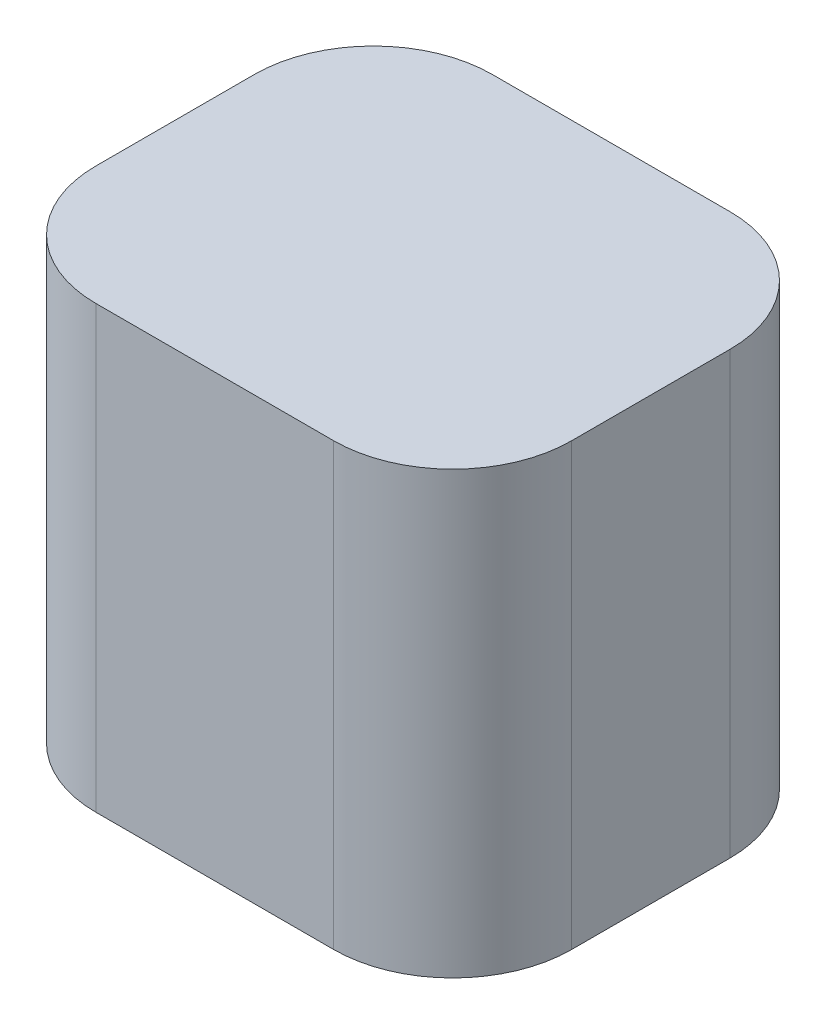
ISO-10303-21;
HEADER;
FILE_DESCRIPTION(('STEP AP214'),'2;1');
FILE_NAME('part.step','',(''),(''),'','','');
FILE_SCHEMA(('AUTOMOTIVE_DESIGN { 1 0 10303 214 1 1 1 1 }'));
ENDSEC;
DATA;
#1=APPLICATION_CONTEXT('core data for automotive mechanical design processes');
#2=APPLICATION_PROTOCOL_DEFINITION('international standard','automotive_design',2000,#1);
#3=PRODUCT_CONTEXT('',#1,'mechanical');
#4=PRODUCT('Part','Part','',(#3));
#5=PRODUCT_RELATED_PRODUCT_CATEGORY('part','',(#4));
#6=PRODUCT_DEFINITION_FORMATION('','',#4);
#7=PRODUCT_DEFINITION_CONTEXT('part definition',#1,'design');
#8=PRODUCT_DEFINITION('design','',#6,#7);
#9=PRODUCT_DEFINITION_SHAPE('','',#8);
#10=(LENGTH_UNIT() NAMED_UNIT(*) SI_UNIT(.MILLI.,.METRE.));
#11=(NAMED_UNIT(*) PLANE_ANGLE_UNIT() SI_UNIT($,.RADIAN.));
#12=(NAMED_UNIT(*) SI_UNIT($,.STERADIAN.) SOLID_ANGLE_UNIT());
#13=UNCERTAINTY_MEASURE_WITH_UNIT(LENGTH_MEASURE(1.E-05),#10,'distance_accuracy_value','');
#14=(GEOMETRIC_REPRESENTATION_CONTEXT(3) GLOBAL_UNCERTAINTY_ASSIGNED_CONTEXT((#13)) GLOBAL_UNIT_ASSIGNED_CONTEXT((#10,
#11,#12)) REPRESENTATION_CONTEXT('',''));
#15=CARTESIAN_POINT('',(0.,0.,0.));
#16=DIRECTION('',(0.,0.,1.));
#17=DIRECTION('',(1.,0.,0.));
#18=AXIS2_PLACEMENT_3D('',#15,#16,#17);
#19=CARTESIAN_POINT('',(33.,10.6109045973641,62.9026152266645));
#20=DIRECTION('',(-1.,0.,0.));
#21=DIRECTION('',(0.,0.,1.));
#22=AXIS2_PLACEMENT_3D('',#19,#20,#21);
#23=PLANE('',#22);
#24=DIRECTION('',(0.,0.,-1.));
#25=VECTOR('',#24,1.);
#26=CARTESIAN_POINT('',(33.,0.,62.9026152266645));
#27=LINE('',#26,#25);
#28=CARTESIAN_POINT('',(33.,0.,-3.));
#29=VERTEX_POINT('',#28);
#30=CARTESIAN_POINT('',(33.,0.,-7.00000000000001));
#31=VERTEX_POINT('',#30);
#32=EDGE_CURVE('E144',#29,#31,#27,.T.);
#33=ORIENTED_EDGE('',*,*,#32,.F.);
#34=DIRECTION('',(0.,-1.,0.));
#35=VECTOR('',#34,1.);
#36=CARTESIAN_POINT('',(33.,10.6109045973641,-3.));
#37=LINE('',#36,#35);
#38=CARTESIAN_POINT('',(33.,3.80545229868206,-3.));
#39=VERTEX_POINT('',#38);
#40=EDGE_CURVE('E175',#29,#39,#37,.F.);
#41=ORIENTED_EDGE('',*,*,#40,.T.);
#42=CARTESIAN_POINT('',(33.,5.30545229868207,-5.));
#43=DIRECTION('',(1.,0.,0.));
#44=DIRECTION('',(0.,1.,0.));
#45=AXIS2_PLACEMENT_3D('',#42,#43,#44);
#46=CIRCLE('',#45,2.5);
#47=CARTESIAN_POINT('',(33.,3.80545229868207,-7.00000000000001));
#48=VERTEX_POINT('',#47);
#49=EDGE_CURVE('E254',#39,#48,#46,.T.);
#50=ORIENTED_EDGE('',*,*,#49,.T.);
#51=DIRECTION('',(0.,-1.,0.));
#52=VECTOR('',#51,1.);
#53=CARTESIAN_POINT('',(33.,0.,-7.00000000000001));
#54=LINE('',#53,#52);
#55=EDGE_CURVE('E169',#48,#31,#54,.T.);
#56=ORIENTED_EDGE('',*,*,#55,.T.);
#57=EDGE_LOOP('',(#33,#41,#50,#56));
#58=FACE_BOUND('',#57,.T.);
#59=ADVANCED_FACE('F33',(#58),#23,.T.);
#60=CARTESIAN_POINT('',(22.5,17.9146219807209,-10.));
#61=DIRECTION('',(0.,0.,1.));
#62=DIRECTION('',(1.,0.,0.));
#63=AXIS2_PLACEMENT_3D('',#60,#61,#62);
#64=PLANE('',#63);
#65=DIRECTION('',(-1.,0.,0.));
#66=VECTOR('',#65,1.);
#67=CARTESIAN_POINT('',(35.,11.1125,-10.));
#68=LINE('',#67,#66);
#69=CARTESIAN_POINT('',(42.,11.1125,-10.));
#70=VERTEX_POINT('',#69);
#71=CARTESIAN_POINT('',(36.,11.1125,-10.));
#72=VERTEX_POINT('',#71);
#73=EDGE_CURVE('E142',#70,#72,#68,.T.);
#74=ORIENTED_EDGE('',*,*,#73,.F.);
#75=DIRECTION('',(0.,1.,0.));
#76=VECTOR('',#75,1.);
#77=CARTESIAN_POINT('',(42.,0.,-10.));
#78=LINE('',#77,#76);
#79=CARTESIAN_POINT('',(42.,0.,-10.));
#80=VERTEX_POINT('',#79);
#81=EDGE_CURVE('E11',#70,#80,#78,.F.);
#82=ORIENTED_EDGE('',*,*,#81,.T.);
#83=DIRECTION('',(1.,0.,0.));
#84=VECTOR('',#83,1.);
#85=CARTESIAN_POINT('',(0.,0.,-10.));
#86=LINE('',#85,#84);
#87=CARTESIAN_POINT('',(36.,0.,-10.));
#88=VERTEX_POINT('',#87);
#89=EDGE_CURVE('E139',#88,#80,#86,.T.);
#90=ORIENTED_EDGE('',*,*,#89,.F.);
#91=DIRECTION('',(0.,-1.,0.));
#92=VECTOR('',#91,1.);
#93=CARTESIAN_POINT('',(36.,11.1125,-10.));
#94=LINE('',#93,#92);
#95=EDGE_CURVE('E42',#88,#72,#94,.F.);
#96=ORIENTED_EDGE('',*,*,#95,.T.);
#97=EDGE_LOOP('',(#74,#82,#90,#96));
#98=FACE_BOUND('',#97,.T.);
#99=ADVANCED_FACE('F203',(#98),#64,.F.);
#100=CARTESIAN_POINT('',(22.5,17.9146219807209,0.));
#101=DIRECTION('',(0.,0.,1.));
#102=DIRECTION('',(1.,0.,0.));
#103=AXIS2_PLACEMENT_3D('',#100,#101,#102);
#104=PLANE('',#103);
#105=DIRECTION('',(1.,0.,0.));
#106=VECTOR('',#105,1.);
#107=CARTESIAN_POINT('',(0.,0.,0.));
#108=LINE('',#107,#106);
#109=CARTESIAN_POINT('',(36.,0.,0.));
#110=VERTEX_POINT('',#109);
#111=CARTESIAN_POINT('',(42.,0.,0.));
#112=VERTEX_POINT('',#111);
#113=EDGE_CURVE('E132',#110,#112,#108,.T.);
#114=ORIENTED_EDGE('',*,*,#113,.T.);
#115=DIRECTION('',(0.,1.,0.));
#116=VECTOR('',#115,1.);
#117=CARTESIAN_POINT('',(42.,17.9146219807209,0.));
#118=LINE('',#117,#116);
#119=CARTESIAN_POINT('',(42.,11.1125,0.));
#120=VERTEX_POINT('',#119);
#121=EDGE_CURVE('E115',#112,#120,#118,.T.);
#122=ORIENTED_EDGE('',*,*,#121,.T.);
#123=DIRECTION('',(-1.,0.,0.));
#124=VECTOR('',#123,1.);
#125=CARTESIAN_POINT('',(35.,11.1125,0.));
#126=LINE('',#125,#124);
#127=CARTESIAN_POINT('',(36.,11.1125,0.));
#128=VERTEX_POINT('',#127);
#129=EDGE_CURVE('E129',#120,#128,#126,.T.);
#130=ORIENTED_EDGE('',*,*,#129,.T.);
#131=DIRECTION('',(0.,-1.,0.));
#132=VECTOR('',#131,1.);
#133=CARTESIAN_POINT('',(36.,17.9146219807209,0.));
#134=LINE('',#133,#132);
#135=EDGE_CURVE('E134',#128,#110,#134,.T.);
#136=ORIENTED_EDGE('',*,*,#135,.T.);
#137=EDGE_LOOP('',(#114,#122,#130,#136));
#138=FACE_BOUND('',#137,.T.);
#139=ADVANCED_FACE('F127',(#138),#104,.T.);
#140=CARTESIAN_POINT('',(0.,0.,-10.));
#141=DIRECTION('',(0.,-1.,0.));
#142=DIRECTION('',(0.,0.,-1.));
#143=AXIS2_PLACEMENT_3D('',#140,#141,#142);
#144=PLANE('',#143);
#145=CARTESIAN_POINT('',(41.5,0.,-5.));
#146=DIRECTION('',(0.,-1.,0.));
#147=DIRECTION('',(0.,0.,-1.));
#148=AXIS2_PLACEMENT_3D('',#145,#146,#147);
#149=CIRCLE('',#148,2.);
#150=CARTESIAN_POINT('',(41.5,0.,-7.));
#151=VERTEX_POINT('',#150);
#152=EDGE_CURVE('E258',#151,#151,#149,.T.);
#153=ORIENTED_EDGE('',*,*,#152,.F.);
#154=EDGE_LOOP('',(#153));
#155=FACE_BOUND('',#154,.T.);
#156=DIRECTION('',(0.,0.,1.));
#157=VECTOR('',#156,1.);
#158=CARTESIAN_POINT('',(45.,0.,-10.));
#159=LINE('',#158,#157);
#160=CARTESIAN_POINT('',(45.,0.,-7.));
#161=VERTEX_POINT('',#160);
#162=CARTESIAN_POINT('',(45.,0.,-3.));
#163=VERTEX_POINT('',#162);
#164=EDGE_CURVE('E150',#161,#163,#159,.T.);
#165=ORIENTED_EDGE('',*,*,#164,.T.);
#166=CARTESIAN_POINT('',(42.,0.,-3.));
#167=DIRECTION('',(0.,-1.,0.));
#168=DIRECTION('',(0.,0.,-1.));
#169=AXIS2_PLACEMENT_3D('',#166,#167,#168);
#170=CIRCLE('',#169,3.);
#171=EDGE_CURVE('E167',#163,#112,#170,.T.);
#172=ORIENTED_EDGE('',*,*,#171,.T.);
#173=ORIENTED_EDGE('',*,*,#113,.F.);
#174=CARTESIAN_POINT('',(36.,0.,-3.));
#175=DIRECTION('',(0.,-1.,0.));
#176=DIRECTION('',(0.,0.,-1.));
#177=AXIS2_PLACEMENT_3D('',#174,#175,#176);
#178=CIRCLE('',#177,3.);
#179=EDGE_CURVE('E165',#110,#29,#178,.T.);
#180=ORIENTED_EDGE('',*,*,#179,.T.);
#181=ORIENTED_EDGE('',*,*,#32,.T.);
#182=CARTESIAN_POINT('',(36.,0.,-7.00000000000001));
#183=DIRECTION('',(0.,-1.,0.));
#184=DIRECTION('',(0.,0.,-1.));
#185=AXIS2_PLACEMENT_3D('',#182,#183,#184);
#186=CIRCLE('',#185,3.);
#187=EDGE_CURVE('E161',#31,#88,#186,.T.);
#188=ORIENTED_EDGE('',*,*,#187,.T.);
#189=ORIENTED_EDGE('',*,*,#89,.T.);
#190=CARTESIAN_POINT('',(42.,0.,-7.));
#191=DIRECTION('',(0.,-1.,0.));
#192=DIRECTION('',(0.,0.,-1.));
#193=AXIS2_PLACEMENT_3D('',#190,#191,#192);
#194=CIRCLE('',#193,3.);
#195=EDGE_CURVE('E163',#80,#161,#194,.T.);
#196=ORIENTED_EDGE('',*,*,#195,.T.);
#197=EDGE_LOOP('',(#165,#172,#173,#180,#181,#188,#189,#196));
#198=FACE_BOUND('',#197,.T.);
#199=ADVANCED_FACE('F209',(#155,#198),#144,.T.);
#200=CARTESIAN_POINT('',(35.,11.1125,-10.));
#201=DIRECTION('',(0.,1.,0.));
#202=DIRECTION('',(-1.,0.,0.));
#203=AXIS2_PLACEMENT_3D('',#200,#201,#202);
#204=PLANE('',#203);
#205=ORIENTED_EDGE('',*,*,#129,.F.);
#206=CARTESIAN_POINT('',(42.,11.1125,-3.));
#207=DIRECTION('',(0.,1.,0.));
#208=DIRECTION('',(-1.,0.,0.));
#209=AXIS2_PLACEMENT_3D('',#206,#207,#208);
#210=CIRCLE('',#209,3.);
#211=CARTESIAN_POINT('',(45.,11.1125,-3.));
#212=VERTEX_POINT('',#211);
#213=EDGE_CURVE('E111',#120,#212,#210,.T.);
#214=ORIENTED_EDGE('',*,*,#213,.T.);
#215=DIRECTION('',(0.,0.,1.));
#216=VECTOR('',#215,1.);
#217=CARTESIAN_POINT('',(45.,11.1125,-10.));
#218=LINE('',#217,#216);
#219=CARTESIAN_POINT('',(45.,11.1125,-7.));
#220=VERTEX_POINT('',#219);
#221=EDGE_CURVE('E148',#220,#212,#218,.T.);
#222=ORIENTED_EDGE('',*,*,#221,.F.);
#223=CARTESIAN_POINT('',(42.,11.1125,-7.));
#224=DIRECTION('',(0.,1.,0.));
#225=DIRECTION('',(-1.,0.,0.));
#226=AXIS2_PLACEMENT_3D('',#223,#224,#225);
#227=CIRCLE('',#226,3.);
#228=EDGE_CURVE('E155',#220,#70,#227,.T.);
#229=ORIENTED_EDGE('',*,*,#228,.T.);
#230=ORIENTED_EDGE('',*,*,#73,.T.);
#231=CARTESIAN_POINT('',(36.,11.1125,-7.00000000000001));
#232=DIRECTION('',(0.,1.,0.));
#233=DIRECTION('',(-1.,0.,0.));
#234=AXIS2_PLACEMENT_3D('',#231,#232,#233);
#235=CIRCLE('',#234,3.);
#236=CARTESIAN_POINT('',(33.,11.1125,-7.00000000000001));
#237=VERTEX_POINT('',#236);
#238=EDGE_CURVE('E133',#72,#237,#235,.T.);
#239=ORIENTED_EDGE('',*,*,#238,.T.);
#240=DIRECTION('',(0.,0.,1.));
#241=VECTOR('',#240,1.);
#242=CARTESIAN_POINT('',(33.,11.1125,62.9026152266645));
#243=LINE('',#242,#241);
#244=CARTESIAN_POINT('',(33.,11.1125,-3.));
#245=VERTEX_POINT('',#244);
#246=EDGE_CURVE('E253',#237,#245,#243,.T.);
#247=ORIENTED_EDGE('',*,*,#246,.T.);
#248=CARTESIAN_POINT('',(36.,11.1125,-3.));
#249=DIRECTION('',(0.,1.,0.));
#250=DIRECTION('',(-1.,0.,0.));
#251=AXIS2_PLACEMENT_3D('',#248,#249,#250);
#252=CIRCLE('',#251,3.);
#253=EDGE_CURVE('E122',#245,#128,#252,.T.);
#254=ORIENTED_EDGE('',*,*,#253,.T.);
#255=EDGE_LOOP('',(#205,#214,#222,#229,#230,#239,#247,#254));
#256=FACE_BOUND('',#255,.T.);
#257=ADVANCED_FACE('F136',(#256),#204,.T.);
#258=CARTESIAN_POINT('',(45.,11.1125,-10.));
#259=DIRECTION('',(1.,0.,0.));
#260=DIRECTION('',(0.,0.,-1.));
#261=AXIS2_PLACEMENT_3D('',#258,#259,#260);
#262=PLANE('',#261);
#263=ORIENTED_EDGE('',*,*,#221,.T.);
#264=DIRECTION('',(0.,1.,0.));
#265=VECTOR('',#264,1.);
#266=CARTESIAN_POINT('',(45.,11.1125,-3.));
#267=LINE('',#266,#265);
#268=EDGE_CURVE('E116',#212,#163,#267,.F.);
#269=ORIENTED_EDGE('',*,*,#268,.T.);
#270=ORIENTED_EDGE('',*,*,#164,.F.);
#271=DIRECTION('',(0.,1.,0.));
#272=VECTOR('',#271,1.);
#273=CARTESIAN_POINT('',(45.,11.1125,-7.));
#274=LINE('',#273,#272);
#275=EDGE_CURVE('E121',#161,#220,#274,.T.);
#276=ORIENTED_EDGE('',*,*,#275,.T.);
#277=EDGE_LOOP('',(#263,#269,#270,#276));
#278=FACE_BOUND('',#277,.T.);
#279=ADVANCED_FACE('F201',(#278),#262,.T.);
#280=CARTESIAN_POINT('',(33.,6.80545229868206,-7.00000000000001));
#281=VERTEX_POINT('',#280);
#282=CARTESIAN_POINT('',(33.,6.80545229868207,-3.));
#283=VERTEX_POINT('',#282);
#284=EDGE_CURVE('E252',#281,#283,#46,.T.);
#285=ORIENTED_EDGE('',*,*,#284,.T.);
#286=DIRECTION('',(0.,-1.,0.));
#287=VECTOR('',#286,1.);
#288=CARTESIAN_POINT('',(33.,10.6109045973641,-3.));
#289=LINE('',#288,#287);
#290=EDGE_CURVE('E173',#283,#245,#289,.F.);
#291=ORIENTED_EDGE('',*,*,#290,.T.);
#292=ORIENTED_EDGE('',*,*,#246,.F.);
#293=DIRECTION('',(0.,-1.,0.));
#294=VECTOR('',#293,1.);
#295=CARTESIAN_POINT('',(33.,0.,-7.00000000000001));
#296=LINE('',#295,#294);
#297=EDGE_CURVE('E171',#237,#281,#296,.T.);
#298=ORIENTED_EDGE('',*,*,#297,.T.);
#299=EDGE_LOOP('',(#285,#291,#292,#298));
#300=FACE_BOUND('',#299,.T.);
#301=ADVANCED_FACE('F195',(#300),#23,.T.);
#302=CARTESIAN_POINT('',(39.,5.30545229868207,-5.));
#303=DIRECTION('',(-1.,0.,0.));
#304=DIRECTION('',(0.,0.,1.));
#305=AXIS2_PLACEMENT_3D('',#302,#303,#304);
#306=CYLINDRICAL_SURFACE('',#305,2.5);
#307=CARTESIAN_POINT('',(39.,5.30545229868207,-5.));
#308=DIRECTION('',(1.,0.,0.));
#309=DIRECTION('',(0.,1.,0.));
#310=AXIS2_PLACEMENT_3D('',#307,#308,#309);
#311=CIRCLE('',#310,2.5);
#312=CARTESIAN_POINT('',(39.,7.80545229868207,-5.));
#313=VERTEX_POINT('',#312);
#314=EDGE_CURVE('E240',#313,#313,#311,.T.);
#315=ORIENTED_EDGE('',*,*,#314,.T.);
#316=EDGE_LOOP('',(#315));
#317=FACE_BOUND('',#316,.T.);
#318=ORIENTED_EDGE('',*,*,#49,.F.);
#319=CARTESIAN_POINT('',(33.,3.80545229868206,-3.));
#320=CARTESIAN_POINT('',(33.0000066780657,3.86153493164068,-2.95792955387831));
#321=CARTESIAN_POINT('',(33.000885170512,3.9193832578688,-2.91823806848176));
#322=CARTESIAN_POINT('',(33.003832789912,4.03817259286443,-2.84386853587168));
#323=CARTESIAN_POINT('',(33.0059016495303,4.09911290442547,-2.8091893651679));
#324=CARTESIAN_POINT('',(33.0106776412208,4.22367653603658,-2.74507908324186));
#325=CARTESIAN_POINT('',(33.0133848088217,4.28730000527108,-2.7156482643066));
#326=CARTESIAN_POINT('',(33.0189549577311,4.41676919472114,-2.66223330711288));
#327=CARTESIAN_POINT('',(33.0218179446196,4.48261499448616,-2.63824936406617));
#328=CARTESIAN_POINT('',(33.0299802078502,4.68284532446787,-2.5747322334044));
#329=CARTESIAN_POINT('',(33.0348579864896,4.82002257862195,-2.54358249220483));
#330=CARTESIAN_POINT('',(33.0411004553504,5.09757563860978,-2.50471817907327));
#331=CARTESIAN_POINT('',(33.0424676845759,5.23794905864276,-2.49698666918348));
#332=CARTESIAN_POINT('',(33.0411005275398,5.51732758306778,-2.50509804045992));
#333=CARTESIAN_POINT('',(33.0383858289987,5.65633602132253,-2.52082776181419));
#334=CARTESIAN_POINT('',(33.0301030090878,5.9297632464949,-2.57519473372287));
#335=CARTESIAN_POINT('',(33.0245336410886,6.06418000085465,-2.61384199348635));
#336=CARTESIAN_POINT('',(33.0142623928658,6.30350075095229,-2.70489214258173));
#337=CARTESIAN_POINT('',(33.0095666644967,6.40965033806211,-2.75403774763696));
#338=CARTESIAN_POINT('',(33.0042204405734,6.56288742071753,-2.838458910302));
#339=CARTESIAN_POINT('',(33.0027214688565,6.61295352153051,-2.86837182346367));
#340=CARTESIAN_POINT('',(33.000612415103,6.7109005167975,-2.93163944666428));
#341=CARTESIAN_POINT('',(33.0000025873338,6.75878078238005,-2.96499513831217));
#342=CARTESIAN_POINT('',(33.,6.80545229868207,-3.));
#343=B_SPLINE_CURVE_WITH_KNOTS('',3,(#319,#320,#321,#322,#323,#324,#325,#326,#327,#328,#329,
#330,#331,#332,#333,#334,#335,#336,#337,#338,#339,#340,#341,#342),.UNSPECIFIED.,.F.,.F.,(4,2,2,
2,2,2,2,2,2,2,2,4),(0.,0.210235486583615,0.420423776401095,0.630623768202684,0.840831292217674,
1.26091362427922,1.68069204620186,2.09845230086933,2.51639514637855,2.8663990104264,
3.04128920196876,3.21622939687738),.UNSPECIFIED.);
#344=EDGE_CURVE('E183',#39,#283,#343,.T.);
#345=ORIENTED_EDGE('',*,*,#344,.T.);
#346=ORIENTED_EDGE('',*,*,#284,.F.);
#347=CARTESIAN_POINT('',(33.,6.80545229868206,-7.00000000000001));
#348=CARTESIAN_POINT('',(33.0000066780657,6.74936966572343,-7.0420704461217));
#349=CARTESIAN_POINT('',(33.000885170512,6.69152133949532,-7.08176193151825));
#350=CARTESIAN_POINT('',(33.003832789912,6.57273200449968,-7.15613146412833));
#351=CARTESIAN_POINT('',(33.0059016495303,6.51179169293864,-7.19081063483211));
#352=CARTESIAN_POINT('',(33.0106776412208,6.38722806132753,-7.25492091675814));
#353=CARTESIAN_POINT('',(33.0133848088217,6.32360459209303,-7.28435173569341));
#354=CARTESIAN_POINT('',(33.0189549577311,6.19413540264297,-7.33776669288712));
#355=CARTESIAN_POINT('',(33.0218179446196,6.12828960287795,-7.36175063593383));
#356=CARTESIAN_POINT('',(33.0299802078502,5.92805927289623,-7.4252677665956));
#357=CARTESIAN_POINT('',(33.0348579864896,5.79088201874215,-7.45641750779517));
#358=CARTESIAN_POINT('',(33.0411004553504,5.51332895875432,-7.49528182092673));
#359=CARTESIAN_POINT('',(33.0424676845759,5.37295553872134,-7.50301333081652));
#360=CARTESIAN_POINT('',(33.0411005275398,5.09357701429633,-7.49490195954007));
#361=CARTESIAN_POINT('',(33.0383858289987,4.95456857604157,-7.4791722381858));
#362=CARTESIAN_POINT('',(33.0301030090878,4.68114135086921,-7.42480526627712));
#363=CARTESIAN_POINT('',(33.0245336410886,4.54672459650946,-7.38615800651364));
#364=CARTESIAN_POINT('',(33.0142623928658,4.30740384641183,-7.29510785741826));
#365=CARTESIAN_POINT('',(33.0095666644967,4.20125425930202,-7.24596225236303));
#366=CARTESIAN_POINT('',(33.0042204405734,4.0480171766466,-7.161541089698));
#367=CARTESIAN_POINT('',(33.0027214688565,3.99795107583363,-7.13162817653633));
#368=CARTESIAN_POINT('',(33.000612415103,3.90000408056665,-7.06836055333572));
#369=CARTESIAN_POINT('',(33.0000025873338,3.85212381498409,-7.03500486168784));
#370=CARTESIAN_POINT('',(33.,3.80545229868207,-7.00000000000001));
#371=B_SPLINE_CURVE_WITH_KNOTS('',3,(#347,#348,#349,#350,#351,#352,#353,#354,#355,#356,#357,
#358,#359,#360,#361,#362,#363,#364,#365,#366,#367,#368,#369,#370),.UNSPECIFIED.,.F.,.F.,(4,2,2,
2,2,2,2,2,2,2,2,4),(0.,0.210235486583615,0.420423776401096,0.630623768202686,0.840831292217676,
1.26091362427923,1.68069204620186,2.09845230086933,2.51639514637855,2.86639901042638,
3.04128920196873,3.21622939687734),.UNSPECIFIED.);
#372=EDGE_CURVE('E49',#281,#48,#371,.T.);
#373=ORIENTED_EDGE('',*,*,#372,.T.);
#374=EDGE_LOOP('',(#318,#345,#346,#373));
#375=FACE_BOUND('',#374,.T.);
#376=ADVANCED_FACE('F189',(#317,#375),#306,.F.);
#377=CARTESIAN_POINT('',(39.,5.30545229868207,-5.));
#378=DIRECTION('',(-1.,0.,0.));
#379=DIRECTION('',(0.,1.,0.));
#380=AXIS2_PLACEMENT_3D('',#377,#378,#379);
#381=PLANE('',#380);
#382=CARTESIAN_POINT('',(39.,5.30545229868207,-5.));
#383=DIRECTION('',(1.,0.,0.));
#384=DIRECTION('',(0.,1.,0.));
#385=AXIS2_PLACEMENT_3D('',#382,#383,#384);
#386=CIRCLE('',#385,2.);
#387=CARTESIAN_POINT('',(39.,7.30545229868207,-5.));
#388=VERTEX_POINT('',#387);
#389=EDGE_CURVE('E255',#388,#388,#386,.T.);
#390=ORIENTED_EDGE('',*,*,#389,.T.);
#391=EDGE_LOOP('',(#390));
#392=FACE_BOUND('',#391,.T.);
#393=ORIENTED_EDGE('',*,*,#314,.F.);
#394=EDGE_LOOP('',(#393));
#395=FACE_BOUND('',#394,.T.);
#396=ADVANCED_FACE('F194',(#392,#395),#381,.T.);
#397=CARTESIAN_POINT('',(39.,2.80545229868206,-5.));
#398=DIRECTION('',(0.,0.,-1.));
#399=DIRECTION('',(1.,0.,0.));
#400=AXIS2_PLACEMENT_3D('',#397,#398,#399);
#401=TOROIDAL_SURFACE('',#400,2.5,2.);
#402=CARTESIAN_POINT('',(41.5,2.80545229868206,-5.));
#403=DIRECTION('',(0.,-1.,0.));
#404=DIRECTION('',(1.,0.,0.));
#405=AXIS2_PLACEMENT_3D('',#402,#403,#404);
#406=CIRCLE('',#405,2.);
#407=CARTESIAN_POINT('',(43.5,2.80545229868205,-5.));
#408=VERTEX_POINT('',#407);
#409=EDGE_CURVE('E265',#408,#408,#406,.T.);
#410=CARTESIAN_POINT('',(39.,2.80545229868206,-5.));
#411=DIRECTION('',(0.,0.,-1.));
#412=DIRECTION('',(1.,0.,0.));
#413=AXIS2_PLACEMENT_3D('',#410,#411,#412);
#414=CIRCLE('',#413,4.5);
#415=EDGE_CURVE('',#388,#408,#414,.T.);
#416=ORIENTED_EDGE('',*,*,#389,.F.);
#417=ORIENTED_EDGE('',*,*,#409,.T.);
#418=ORIENTED_EDGE('',*,*,#415,.T.);
#419=ORIENTED_EDGE('',*,*,#415,.F.);
#420=EDGE_LOOP('',(#416,#418,#417,#419));
#421=FACE_BOUND('',#420,.T.);
#422=ADVANCED_FACE('F272',(#421),#401,.F.);
#423=CARTESIAN_POINT('',(41.5,-5.65685424949238,-5.));
#424=DIRECTION('',(0.,1.,0.));
#425=DIRECTION('',(-1.,0.,0.));
#426=AXIS2_PLACEMENT_3D('',#423,#424,#425);
#427=CYLINDRICAL_SURFACE('',#426,2.);
#428=ORIENTED_EDGE('',*,*,#409,.F.);
#429=EDGE_LOOP('',(#428));
#430=FACE_BOUND('',#429,.T.);
#431=ORIENTED_EDGE('',*,*,#152,.T.);
#432=EDGE_LOOP('',(#431));
#433=FACE_BOUND('',#432,.T.);
#434=ADVANCED_FACE('F220',(#430,#433),#427,.F.);
#435=CARTESIAN_POINT('',(42.,17.9146219807209,-3.));
#436=DIRECTION('',(0.,1.,0.));
#437=DIRECTION('',(0.,0.,1.));
#438=AXIS2_PLACEMENT_3D('',#435,#436,#437);
#439=CYLINDRICAL_SURFACE('',#438,3.);
#440=ORIENTED_EDGE('',*,*,#171,.F.);
#441=ORIENTED_EDGE('',*,*,#268,.F.);
#442=ORIENTED_EDGE('',*,*,#213,.F.);
#443=ORIENTED_EDGE('',*,*,#121,.F.);
#444=EDGE_LOOP('',(#440,#441,#442,#443));
#445=FACE_BOUND('',#444,.T.);
#446=ADVANCED_FACE('F114',(#445),#439,.T.);
#447=CARTESIAN_POINT('',(36.,17.9146219807209,-3.));
#448=DIRECTION('',(0.,-1.,0.));
#449=DIRECTION('',(0.,0.,-1.));
#450=AXIS2_PLACEMENT_3D('',#447,#448,#449);
#451=CYLINDRICAL_SURFACE('',#450,3.);
#452=ORIENTED_EDGE('',*,*,#344,.F.);
#453=ORIENTED_EDGE('',*,*,#40,.F.);
#454=ORIENTED_EDGE('',*,*,#179,.F.);
#455=ORIENTED_EDGE('',*,*,#135,.F.);
#456=ORIENTED_EDGE('',*,*,#253,.F.);
#457=ORIENTED_EDGE('',*,*,#290,.F.);
#458=EDGE_LOOP('',(#452,#453,#454,#455,#456,#457));
#459=FACE_BOUND('',#458,.T.);
#460=ADVANCED_FACE('F219',(#459),#451,.T.);
#461=CARTESIAN_POINT('',(42.,11.1125,-7.));
#462=DIRECTION('',(0.,-1.,0.));
#463=DIRECTION('',(0.,0.,-1.));
#464=AXIS2_PLACEMENT_3D('',#461,#462,#463);
#465=CYLINDRICAL_SURFACE('',#464,3.);
#466=ORIENTED_EDGE('',*,*,#195,.F.);
#467=ORIENTED_EDGE('',*,*,#81,.F.);
#468=ORIENTED_EDGE('',*,*,#228,.F.);
#469=ORIENTED_EDGE('',*,*,#275,.F.);
#470=EDGE_LOOP('',(#466,#467,#468,#469));
#471=FACE_BOUND('',#470,.T.);
#472=ADVANCED_FACE('F223',(#471),#465,.T.);
#473=CARTESIAN_POINT('',(36.,10.6109045973641,-7.00000000000001));
#474=DIRECTION('',(0.,1.,0.));
#475=DIRECTION('',(0.,0.,1.));
#476=AXIS2_PLACEMENT_3D('',#473,#474,#475);
#477=CYLINDRICAL_SURFACE('',#476,3.);
#478=ORIENTED_EDGE('',*,*,#238,.F.);
#479=ORIENTED_EDGE('',*,*,#95,.F.);
#480=ORIENTED_EDGE('',*,*,#187,.F.);
#481=ORIENTED_EDGE('',*,*,#55,.F.);
#482=ORIENTED_EDGE('',*,*,#372,.F.);
#483=ORIENTED_EDGE('',*,*,#297,.F.);
#484=EDGE_LOOP('',(#478,#479,#480,#481,#482,#483));
#485=FACE_BOUND('',#484,.T.);
#486=ADVANCED_FACE('F35',(#485),#477,.T.);
#487=CLOSED_SHELL('',(#59,#99,#139,#199,#257,#279,#301,#376,#396,#422,#434,#446,#460,#472,#486));
#488=MANIFOLD_SOLID_BREP('B2',#487);
#489=ADVANCED_BREP_SHAPE_REPRESENTATION('',(#18,#488),#14);
#490=SHAPE_DEFINITION_REPRESENTATION(#9,#489);
ENDSEC;
END-ISO-10303-21;
